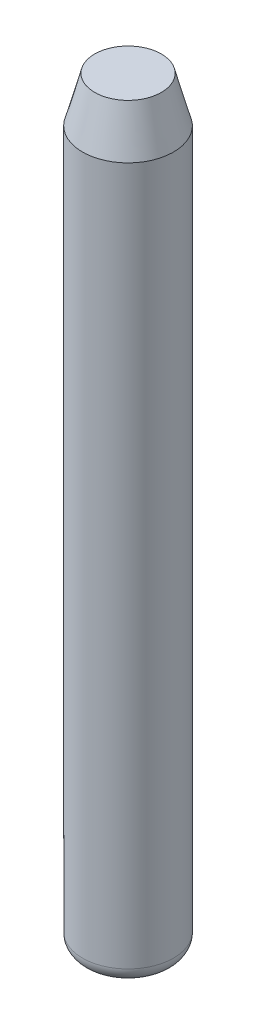
ISO-10303-21;
HEADER;
FILE_DESCRIPTION(('STEP AP214'),'2;1');
FILE_NAME('part.step','',(''),(''),'','','');
FILE_SCHEMA(('AUTOMOTIVE_DESIGN { 1 0 10303 214 1 1 1 1 }'));
ENDSEC;
DATA;
#1=APPLICATION_CONTEXT('core data for automotive mechanical design processes');
#2=APPLICATION_PROTOCOL_DEFINITION('international standard','automotive_design',2000,#1);
#3=PRODUCT_CONTEXT('',#1,'mechanical');
#4=PRODUCT('Part','Part','',(#3));
#5=PRODUCT_RELATED_PRODUCT_CATEGORY('part','',(#4));
#6=PRODUCT_DEFINITION_FORMATION('','',#4);
#7=PRODUCT_DEFINITION_CONTEXT('part definition',#1,'design');
#8=PRODUCT_DEFINITION('design','',#6,#7);
#9=PRODUCT_DEFINITION_SHAPE('','',#8);
#10=(LENGTH_UNIT() NAMED_UNIT(*) SI_UNIT(.MILLI.,.METRE.));
#11=(NAMED_UNIT(*) PLANE_ANGLE_UNIT() SI_UNIT($,.RADIAN.));
#12=(NAMED_UNIT(*) SI_UNIT($,.STERADIAN.) SOLID_ANGLE_UNIT());
#13=UNCERTAINTY_MEASURE_WITH_UNIT(LENGTH_MEASURE(1.E-05),#10,'distance_accuracy_value','');
#14=(GEOMETRIC_REPRESENTATION_CONTEXT(3) GLOBAL_UNCERTAINTY_ASSIGNED_CONTEXT((#13)) GLOBAL_UNIT_ASSIGNED_CONTEXT((#10,
#11,#12)) REPRESENTATION_CONTEXT('',''));
#15=CARTESIAN_POINT('',(0.,0.,0.));
#16=DIRECTION('',(0.,0.,1.));
#17=DIRECTION('',(1.,0.,0.));
#18=AXIS2_PLACEMENT_3D('',#15,#16,#17);
#19=CARTESIAN_POINT('',(0.,25.,0.));
#20=DIRECTION('',(0.,-1.,0.));
#21=DIRECTION('',(0.,0.,-1.));
#22=AXIS2_PLACEMENT_3D('',#19,#20,#21);
#23=CYLINDRICAL_SURFACE('',#22,1.5);
#24=CARTESIAN_POINT('',(0.,0.5,0.));
#25=DIRECTION('',(0.,1.,0.));
#26=DIRECTION('',(0.,0.,1.));
#27=AXIS2_PLACEMENT_3D('',#24,#25,#26);
#28=CIRCLE('',#27,1.5);
#29=CARTESIAN_POINT('',(0.,0.5,1.5));
#30=VERTEX_POINT('',#29);
#31=EDGE_CURVE('E38',#30,#30,#28,.T.);
#32=ORIENTED_EDGE('',*,*,#31,.T.);
#33=EDGE_LOOP('',(#32));
#34=FACE_BOUND('',#33,.T.);
#35=CARTESIAN_POINT('',(0.,23.5,0.));
#36=DIRECTION('',(0.,1.,0.));
#37=DIRECTION('',(0.,0.,1.));
#38=AXIS2_PLACEMENT_3D('',#35,#36,#37);
#39=CIRCLE('',#38,1.5);
#40=CARTESIAN_POINT('',(0.,23.5,-1.5));
#41=VERTEX_POINT('',#40);
#42=EDGE_CURVE('E42',#41,#41,#39,.F.);
#43=ORIENTED_EDGE('',*,*,#42,.T.);
#44=EDGE_LOOP('',(#43));
#45=FACE_BOUND('',#44,.T.);
#46=ADVANCED_FACE('F31',(#34,#45),#23,.T.);
#47=CARTESIAN_POINT('',(0.,25.,0.));
#48=DIRECTION('',(0.,1.,0.));
#49=DIRECTION('',(0.,0.,1.));
#50=AXIS2_PLACEMENT_3D('',#47,#48,#49);
#51=PLANE('',#50);
#52=CARTESIAN_POINT('',(0.,25.,0.));
#53=DIRECTION('',(0.,1.,0.));
#54=DIRECTION('',(0.,0.,1.));
#55=AXIS2_PLACEMENT_3D('',#52,#53,#54);
#56=CIRCLE('',#55,1.09807621135332);
#57=CARTESIAN_POINT('',(0.,25.,-1.09807621135332));
#58=VERTEX_POINT('',#57);
#59=EDGE_CURVE('E46',#58,#58,#56,.T.);
#60=ORIENTED_EDGE('',*,*,#59,.T.);
#61=EDGE_LOOP('',(#60));
#62=FACE_BOUND('',#61,.T.);
#63=ADVANCED_FACE('F52',(#62),#51,.T.);
#64=CARTESIAN_POINT('',(0.,0.,0.));
#65=DIRECTION('',(0.,1.,0.));
#66=DIRECTION('',(0.,0.,1.));
#67=AXIS2_PLACEMENT_3D('',#64,#65,#66);
#68=PLANE('',#67);
#69=CARTESIAN_POINT('',(0.,0.,0.));
#70=DIRECTION('',(0.,1.,0.));
#71=DIRECTION('',(0.,0.,1.));
#72=AXIS2_PLACEMENT_3D('',#69,#70,#71);
#73=CIRCLE('',#72,1.);
#74=CARTESIAN_POINT('',(0.,0.,1.));
#75=VERTEX_POINT('',#74);
#76=EDGE_CURVE('E10',#75,#75,#73,.F.);
#77=ORIENTED_EDGE('',*,*,#76,.T.);
#78=EDGE_LOOP('',(#77));
#79=FACE_BOUND('',#78,.T.);
#80=ADVANCED_FACE('F56',(#79),#68,.F.);
#81=CARTESIAN_POINT('',(0.,25.,0.));
#82=DIRECTION('',(0.,-1.,0.));
#83=DIRECTION('',(0.,0.,-1.));
#84=AXIS2_PLACEMENT_3D('',#81,#82,#83);
#85=CONICAL_SURFACE('',#84,1.09807621135332,0.261799387799146);
#86=CARTESIAN_POINT('',(0.,23.5,-1.5));
#87=CARTESIAN_POINT('',(0.,23.515625,-1.49581329386826));
#88=CARTESIAN_POINT('',(0.,23.53125,-1.49162658773653));
#89=CARTESIAN_POINT('',(0.,23.5625,-1.48325317547306));
#90=CARTESIAN_POINT('',(0.,23.578125,-1.47906646934132));
#91=CARTESIAN_POINT('',(0.,23.609375,-1.47069305707785));
#92=CARTESIAN_POINT('',(0.,23.625,-1.46650635094611));
#93=CARTESIAN_POINT('',(0.,23.65625,-1.45813293868264));
#94=CARTESIAN_POINT('',(0.,23.671875,-1.4539462325509));
#95=CARTESIAN_POINT('',(0.,23.703125,-1.44557282028743));
#96=CARTESIAN_POINT('',(0.,23.71875,-1.44138611415569));
#97=CARTESIAN_POINT('',(0.,23.75,-1.43301270189222));
#98=CARTESIAN_POINT('',(0.,23.765625,-1.42882599576048));
#99=CARTESIAN_POINT('',(0.,23.796875,-1.42045258349701));
#100=CARTESIAN_POINT('',(0.,23.8125,-1.41626587736528));
#101=CARTESIAN_POINT('',(0.,23.84375,-1.4078924651018));
#102=CARTESIAN_POINT('',(0.,23.859375,-1.40370575897007));
#103=CARTESIAN_POINT('',(0.,23.890625,-1.39533234670659));
#104=CARTESIAN_POINT('',(0.,23.90625,-1.39114564057486));
#105=CARTESIAN_POINT('',(0.,23.9375,-1.38277222831139));
#106=CARTESIAN_POINT('',(0.,23.953125,-1.37858552217965));
#107=CARTESIAN_POINT('',(0.,23.984375,-1.37021210991618));
#108=CARTESIAN_POINT('',(0.,24.,-1.36602540378444));
#109=CARTESIAN_POINT('',(0.,24.03125,-1.35765199152097));
#110=CARTESIAN_POINT('',(0.,24.046875,-1.35346528538923));
#111=CARTESIAN_POINT('',(0.,24.078125,-1.34509187312576));
#112=CARTESIAN_POINT('',(0.,24.09375,-1.34090516699402));
#113=CARTESIAN_POINT('',(0.,24.125,-1.33253175473055));
#114=CARTESIAN_POINT('',(0.,24.140625,-1.32834504859881));
#115=CARTESIAN_POINT('',(0.,24.171875,-1.31997163633534));
#116=CARTESIAN_POINT('',(0.,24.1875,-1.3157849302036));
#117=CARTESIAN_POINT('',(0.,24.21875,-1.30741151794013));
#118=CARTESIAN_POINT('',(0.,24.234375,-1.3032248118084));
#119=CARTESIAN_POINT('',(0.,24.265625,-1.29485139954492));
#120=CARTESIAN_POINT('',(0.,24.28125,-1.29066469341319));
#121=CARTESIAN_POINT('',(0.,24.3125,-1.28229128114971));
#122=CARTESIAN_POINT('',(0.,24.328125,-1.27810457501798));
#123=CARTESIAN_POINT('',(0.,24.359375,-1.26973116275451));
#124=CARTESIAN_POINT('',(0.,24.375,-1.26554445662277));
#125=CARTESIAN_POINT('',(0.,24.40625,-1.2571710443593));
#126=CARTESIAN_POINT('',(0.,24.421875,-1.25298433822756));
#127=CARTESIAN_POINT('',(0.,24.453125,-1.24461092596409));
#128=CARTESIAN_POINT('',(0.,24.46875,-1.24042421983235));
#129=CARTESIAN_POINT('',(0.,24.5,-1.23205080756888));
#130=CARTESIAN_POINT('',(0.,24.515625,-1.22786410143714));
#131=CARTESIAN_POINT('',(0.,24.546875,-1.21949068917367));
#132=CARTESIAN_POINT('',(0.,24.5625,-1.21530398304193));
#133=CARTESIAN_POINT('',(0.,24.59375,-1.20693057077846));
#134=CARTESIAN_POINT('',(0.,24.609375,-1.20274386464673));
#135=CARTESIAN_POINT('',(0.,24.640625,-1.19437045238325));
#136=CARTESIAN_POINT('',(0.,24.65625,-1.19018374625152));
#137=CARTESIAN_POINT('',(0.,24.6875,-1.18181033398804));
#138=CARTESIAN_POINT('',(0.,24.703125,-1.17762362785631));
#139=CARTESIAN_POINT('',(0.,24.734375,-1.16925021559284));
#140=CARTESIAN_POINT('',(0.,24.75,-1.1650635094611));
#141=CARTESIAN_POINT('',(0.,24.78125,-1.15669009719763));
#142=CARTESIAN_POINT('',(0.,24.796875,-1.15250339106589));
#143=CARTESIAN_POINT('',(0.,24.828125,-1.14412997880242));
#144=CARTESIAN_POINT('',(0.,24.84375,-1.13994327267068));
#145=CARTESIAN_POINT('',(0.,24.875,-1.13156986040721));
#146=CARTESIAN_POINT('',(0.,24.890625,-1.12738315427547));
#147=CARTESIAN_POINT('',(0.,24.921875,-1.119009742012));
#148=CARTESIAN_POINT('',(0.,24.9375,-1.11482303588026));
#149=CARTESIAN_POINT('',(0.,24.96875,-1.10644962361679));
#150=CARTESIAN_POINT('',(0.,24.984375,-1.10226291748506));
#151=CARTESIAN_POINT('',(0.,25.,-1.09807621135332));
#152=B_SPLINE_CURVE_WITH_KNOTS('',3,(#86,#87,#88,#89,#90,#91,#92,#93,#94,#95,#96,#97,#98,#99,
#100,#101,#102,#103,#104,#105,#106,#107,#108,#109,#110,#111,#112,#113,#114,#115,#116,#117,#118,
#119,#120,#121,#122,#123,#124,#125,#126,#127,#128,#129,#130,#131,#132,#133,#134,#135,#136,#137,
#138,#139,#140,#141,#142,#143,#144,#145,#146,#147,#148,#149,#150,#151),.UNSPECIFIED.,.F.,.F.,(4,
2,2,2,2,2,2,2,2,2,2,2,2,2,2,2,2,2,2,2,2,2,2,2,2,2,2,2,2,2,2,2,4),(0.,0.048528570956721,
0.0970571419134453,0.145585712870166,0.194114283826891,0.242642854783615,0.291171425740336,
0.33969999669706,0.388228567653781,0.436757138610506,0.485285709567227,0.533814280523951,
0.582342851480675,0.630871422437396,0.679399993394121,0.727928564350842,0.776457135307566,
0.82498570626429,0.873514277221011,0.922042848177736,0.970571419134457,1.01909999009118,
1.06762856104791,1.11615713200463,1.16468570296135,1.21321427391807,1.2617428448748,
1.31027141583152,1.35879998678824,1.40732855774497,1.45585712870169,1.50438569965841,
1.55291427061514),.UNSPECIFIED.);
#153=EDGE_CURVE('BSEAM54',#41,#58,#152,.T.);
#154=ORIENTED_EDGE('',*,*,#42,.F.);
#155=ORIENTED_EDGE('',*,*,#59,.F.);
#156=ORIENTED_EDGE('',*,*,#153,.T.);
#157=ORIENTED_EDGE('',*,*,#153,.F.);
#158=EDGE_LOOP('',(#154,#156,#155,#157));
#159=FACE_BOUND('',#158,.T.);
#160=ADVANCED_FACE('F54',(#159),#85,.T.);
#161=CARTESIAN_POINT('',(0.,0.5,0.));
#162=DIRECTION('',(0.,1.,0.));
#163=DIRECTION('',(0.,0.,1.));
#164=AXIS2_PLACEMENT_3D('',#161,#162,#163);
#165=TOROIDAL_SURFACE('',#164,1.,0.5);
#166=ORIENTED_EDGE('',*,*,#76,.F.);
#167=EDGE_LOOP('',(#166));
#168=FACE_BOUND('',#167,.T.);
#169=ORIENTED_EDGE('',*,*,#31,.F.);
#170=EDGE_LOOP('',(#169));
#171=FACE_BOUND('',#170,.T.);
#172=ADVANCED_FACE('F33',(#168,#171),#165,.T.);
#173=CLOSED_SHELL('',(#46,#63,#80,#160,#172));
#174=MANIFOLD_SOLID_BREP('B2',#173);
#175=ADVANCED_BREP_SHAPE_REPRESENTATION('',(#18,#174),#14);
#176=SHAPE_DEFINITION_REPRESENTATION(#9,#175);
ENDSEC;
END-ISO-10303-21;
